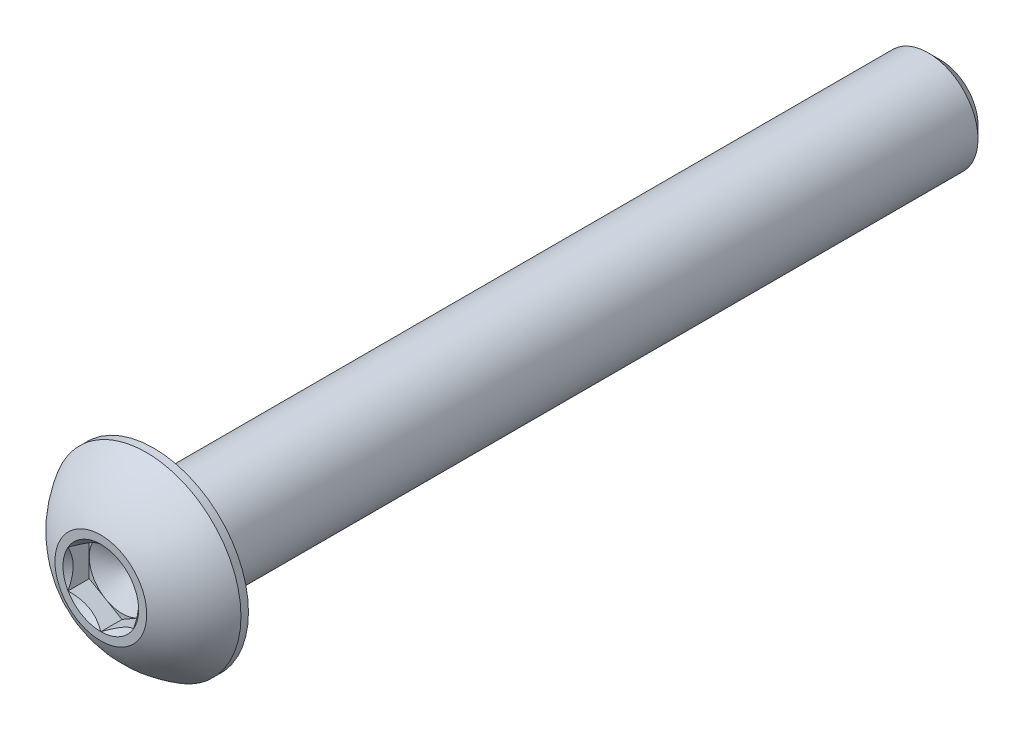
ISO-10303-21;
HEADER;
FILE_DESCRIPTION(('STEP AP214'),'2;1');
FILE_NAME('part.step','',(''),(''),'','','');
FILE_SCHEMA(('AUTOMOTIVE_DESIGN { 1 0 10303 214 1 1 1 1 }'));
ENDSEC;
DATA;
#1=APPLICATION_CONTEXT('core data for automotive mechanical design processes');
#2=APPLICATION_PROTOCOL_DEFINITION('international standard','automotive_design',2000,#1);
#3=PRODUCT_CONTEXT('',#1,'mechanical');
#4=PRODUCT('Part','Part','',(#3));
#5=PRODUCT_RELATED_PRODUCT_CATEGORY('part','',(#4));
#6=PRODUCT_DEFINITION_FORMATION('','',#4);
#7=PRODUCT_DEFINITION_CONTEXT('part definition',#1,'design');
#8=PRODUCT_DEFINITION('design','',#6,#7);
#9=PRODUCT_DEFINITION_SHAPE('','',#8);
#10=(LENGTH_UNIT() NAMED_UNIT(*) SI_UNIT(.MILLI.,.METRE.));
#11=(NAMED_UNIT(*) PLANE_ANGLE_UNIT() SI_UNIT($,.RADIAN.));
#12=(NAMED_UNIT(*) SI_UNIT($,.STERADIAN.) SOLID_ANGLE_UNIT());
#13=UNCERTAINTY_MEASURE_WITH_UNIT(LENGTH_MEASURE(1.E-05),#10,'distance_accuracy_value','');
#14=(GEOMETRIC_REPRESENTATION_CONTEXT(3) GLOBAL_UNCERTAINTY_ASSIGNED_CONTEXT((#13)) GLOBAL_UNIT_ASSIGNED_CONTEXT((#10,
#11,#12)) REPRESENTATION_CONTEXT('',''));
#15=CARTESIAN_POINT('',(0.,0.,0.));
#16=DIRECTION('',(0.,0.,1.));
#17=DIRECTION('',(1.,0.,0.));
#18=AXIS2_PLACEMENT_3D('',#15,#16,#17);
#19=CARTESIAN_POINT('',(0.,0.,19.3065399998886));
#20=DIRECTION('',(0.,0.,1.));
#21=DIRECTION('',(1.,0.,0.));
#22=AXIS2_PLACEMENT_3D('',#19,#20,#21);
#23=CONICAL_SURFACE('',#22,1.5874999998573,1.04719755098333);
#24=CARTESIAN_POINT('',(3.12638803734444E-10,0.,18.3899964475245));
#25=VERTEX_POINT('',#24);
#26=VERTEX_LOOP('',#25);
#27=FACE_BOUND('',#26,.T.);
#28=CARTESIAN_POINT('',(0.,0.,19.3065399999871));
#29=DIRECTION('',(0.,0.,1.));
#30=DIRECTION('',(1.,0.,0.));
#31=AXIS2_PLACEMENT_3D('',#28,#29,#30);
#32=CIRCLE('',#31,1.58750000002783);
#33=CARTESIAN_POINT('',(1.58750000001392,0.,19.3065399999935));
#34=VERTEX_POINT('',#33);
#35=CARTESIAN_POINT('',(0.793750000006958,-1.37481532851985,19.3065399999935));
#36=VERTEX_POINT('',#35);
#37=EDGE_CURVE('E20',#34,#36,#32,.F.);
#38=ORIENTED_EDGE('',*,*,#37,.F.);
#39=CARTESIAN_POINT('',(0.,0.,19.3065399999871));
#40=DIRECTION('',(0.,0.,1.));
#41=DIRECTION('',(1.,0.,0.));
#42=AXIS2_PLACEMENT_3D('',#39,#40,#41);
#43=CIRCLE('',#42,1.58750000002783);
#44=CARTESIAN_POINT('',(0.793750000006957,1.37481532851985,19.3065399999935));
#45=VERTEX_POINT('',#44);
#46=EDGE_CURVE('E408',#45,#34,#43,.F.);
#47=ORIENTED_EDGE('',*,*,#46,.F.);
#48=CARTESIAN_POINT('',(0.,0.,19.3065399999871));
#49=DIRECTION('',(0.,0.,1.));
#50=DIRECTION('',(1.,0.,0.));
#51=AXIS2_PLACEMENT_3D('',#48,#49,#50);
#52=CIRCLE('',#51,1.58750000002783);
#53=CARTESIAN_POINT('',(-0.793750000006959,1.37481532851985,19.3065399999935));
#54=VERTEX_POINT('',#53);
#55=EDGE_CURVE('E113',#54,#45,#52,.F.);
#56=ORIENTED_EDGE('',*,*,#55,.F.);
#57=CARTESIAN_POINT('',(0.,0.,19.3065399999871));
#58=DIRECTION('',(0.,0.,1.));
#59=DIRECTION('',(1.,0.,0.));
#60=AXIS2_PLACEMENT_3D('',#57,#58,#59);
#61=CIRCLE('',#60,1.58750000002783);
#62=CARTESIAN_POINT('',(-1.58750000001392,0.,19.3065399999935));
#63=VERTEX_POINT('',#62);
#64=EDGE_CURVE('E412',#63,#54,#61,.F.);
#65=ORIENTED_EDGE('',*,*,#64,.F.);
#66=CARTESIAN_POINT('',(0.,0.,19.3065399999871));
#67=DIRECTION('',(0.,0.,1.));
#68=DIRECTION('',(1.,0.,0.));
#69=AXIS2_PLACEMENT_3D('',#66,#67,#68);
#70=CIRCLE('',#69,1.58750000002783);
#71=CARTESIAN_POINT('',(-0.793750000006957,-1.37481532851985,19.3065399999935));
#72=VERTEX_POINT('',#71);
#73=EDGE_CURVE('E407',#72,#63,#70,.F.);
#74=ORIENTED_EDGE('',*,*,#73,.F.);
#75=CARTESIAN_POINT('',(0.,0.,19.3065399999871));
#76=DIRECTION('',(0.,0.,1.));
#77=DIRECTION('',(1.,0.,0.));
#78=AXIS2_PLACEMENT_3D('',#75,#76,#77);
#79=CIRCLE('',#78,1.58750000002783);
#80=EDGE_CURVE('E404',#36,#72,#79,.F.);
#81=ORIENTED_EDGE('',*,*,#80,.F.);
#82=EDGE_LOOP('',(#38,#47,#56,#65,#74,#81));
#83=FACE_BOUND('',#82,.T.);
#84=ADVANCED_FACE('F17',(#27,#83),#23,.F.);
#85=CARTESIAN_POINT('',(0.,0.,19.30654));
#86=DIRECTION('',(0.,0.,1.));
#87=DIRECTION('',(1.,0.,0.));
#88=AXIS2_PLACEMENT_3D('',#85,#86,#87);
#89=PLANE('',#88);
#90=DIRECTION('',(0.,1.,0.));
#91=VECTOR('',#90,1.);
#92=CARTESIAN_POINT('',(-1.5875,0.91654355233853,19.30654));
#93=LINE('',#92,#91);
#94=CARTESIAN_POINT('',(-1.5875,-0.916543552338531,19.30654));
#95=VERTEX_POINT('',#94);
#96=EDGE_CURVE('E139',#95,#63,#93,.T.);
#97=ORIENTED_EDGE('',*,*,#96,.F.);
#98=DIRECTION('',(-0.866025403784439,0.5,0.));
#99=VECTOR('',#98,1.);
#100=CARTESIAN_POINT('',(-1.5875,-0.916543552338531,19.30654));
#101=LINE('',#100,#99);
#102=EDGE_CURVE('E163',#72,#95,#101,.T.);
#103=ORIENTED_EDGE('',*,*,#102,.F.);
#104=ORIENTED_EDGE('',*,*,#73,.T.);
#105=EDGE_LOOP('',(#97,#103,#104));
#106=FACE_BOUND('',#105,.T.);
#107=ADVANCED_FACE('F352',(#106),#89,.T.);
#108=CARTESIAN_POINT('',(0.,0.,19.30654));
#109=DIRECTION('',(0.,0.,1.));
#110=DIRECTION('',(1.,0.,0.));
#111=AXIS2_PLACEMENT_3D('',#108,#109,#110);
#112=PLANE('',#111);
#113=DIRECTION('',(-0.866025403784439,0.5,0.));
#114=VECTOR('',#113,1.);
#115=CARTESIAN_POINT('',(-1.5875,-0.916543552338531,19.30654));
#116=LINE('',#115,#114);
#117=CARTESIAN_POINT('',(0.,-1.83308710467706,19.30654));
#118=VERTEX_POINT('',#117);
#119=EDGE_CURVE('E85',#118,#72,#116,.T.);
#120=ORIENTED_EDGE('',*,*,#119,.F.);
#121=DIRECTION('',(-0.866025403784438,-0.5,0.));
#122=VECTOR('',#121,1.);
#123=CARTESIAN_POINT('',(0.,-1.83308710467706,19.30654));
#124=LINE('',#123,#122);
#125=EDGE_CURVE('E154',#36,#118,#124,.T.);
#126=ORIENTED_EDGE('',*,*,#125,.F.);
#127=ORIENTED_EDGE('',*,*,#80,.T.);
#128=EDGE_LOOP('',(#120,#126,#127));
#129=FACE_BOUND('',#128,.T.);
#130=ADVANCED_FACE('F349',(#129),#112,.T.);
#131=CARTESIAN_POINT('',(0.,0.,19.30654));
#132=DIRECTION('',(0.,0.,1.));
#133=DIRECTION('',(1.,0.,0.));
#134=AXIS2_PLACEMENT_3D('',#131,#132,#133);
#135=PLANE('',#134);
#136=DIRECTION('',(-0.866025403784438,-0.5,0.));
#137=VECTOR('',#136,1.);
#138=CARTESIAN_POINT('',(0.,-1.83308710467706,19.30654));
#139=LINE('',#138,#137);
#140=CARTESIAN_POINT('',(1.5875,-0.91654355233853,19.30654));
#141=VERTEX_POINT('',#140);
#142=EDGE_CURVE('E151',#141,#36,#139,.T.);
#143=ORIENTED_EDGE('',*,*,#142,.F.);
#144=DIRECTION('',(0.,-1.,0.));
#145=VECTOR('',#144,1.);
#146=CARTESIAN_POINT('',(1.5875,-0.916543552338531,19.30654));
#147=LINE('',#146,#145);
#148=EDGE_CURVE('E143',#34,#141,#147,.T.);
#149=ORIENTED_EDGE('',*,*,#148,.F.);
#150=ORIENTED_EDGE('',*,*,#37,.T.);
#151=EDGE_LOOP('',(#143,#149,#150));
#152=FACE_BOUND('',#151,.T.);
#153=ADVANCED_FACE('F346',(#152),#135,.T.);
#154=CARTESIAN_POINT('',(0.,0.,19.30654));
#155=DIRECTION('',(0.,0.,1.));
#156=DIRECTION('',(1.,0.,0.));
#157=AXIS2_PLACEMENT_3D('',#154,#155,#156);
#158=PLANE('',#157);
#159=DIRECTION('',(0.,-1.,0.));
#160=VECTOR('',#159,1.);
#161=CARTESIAN_POINT('',(1.5875,-0.916543552338531,19.30654));
#162=LINE('',#161,#160);
#163=CARTESIAN_POINT('',(1.5875,0.916543552338532,19.30654));
#164=VERTEX_POINT('',#163);
#165=EDGE_CURVE('E100',#164,#34,#162,.T.);
#166=ORIENTED_EDGE('',*,*,#165,.F.);
#167=DIRECTION('',(0.866025403784439,-0.499999999999999,0.));
#168=VECTOR('',#167,1.);
#169=CARTESIAN_POINT('',(1.5875,0.916543552338532,19.30654));
#170=LINE('',#169,#168);
#171=EDGE_CURVE('E115',#45,#164,#170,.T.);
#172=ORIENTED_EDGE('',*,*,#171,.F.);
#173=ORIENTED_EDGE('',*,*,#46,.T.);
#174=EDGE_LOOP('',(#166,#172,#173));
#175=FACE_BOUND('',#174,.T.);
#176=ADVANCED_FACE('F342',(#175),#158,.T.);
#177=CARTESIAN_POINT('',(0.,0.,19.30654));
#178=DIRECTION('',(0.,0.,1.));
#179=DIRECTION('',(1.,0.,0.));
#180=AXIS2_PLACEMENT_3D('',#177,#178,#179);
#181=PLANE('',#180);
#182=DIRECTION('',(0.866025403784438,0.500000000000001,0.));
#183=VECTOR('',#182,1.);
#184=CARTESIAN_POINT('',(0.,1.83308710467706,19.30654));
#185=LINE('',#184,#183);
#186=CARTESIAN_POINT('',(-1.5875,0.91654355233853,19.30654));
#187=VERTEX_POINT('',#186);
#188=EDGE_CURVE('E127',#187,#54,#185,.T.);
#189=ORIENTED_EDGE('',*,*,#188,.F.);
#190=DIRECTION('',(0.,1.,0.));
#191=VECTOR('',#190,1.);
#192=CARTESIAN_POINT('',(-1.5875,0.91654355233853,19.30654));
#193=LINE('',#192,#191);
#194=EDGE_CURVE('E94',#63,#187,#193,.T.);
#195=ORIENTED_EDGE('',*,*,#194,.F.);
#196=ORIENTED_EDGE('',*,*,#64,.T.);
#197=EDGE_LOOP('',(#189,#195,#196));
#198=FACE_BOUND('',#197,.T.);
#199=ADVANCED_FACE('F339',(#198),#181,.T.);
#200=CARTESIAN_POINT('',(0.,0.,19.30654));
#201=DIRECTION('',(0.,0.,1.));
#202=DIRECTION('',(1.,0.,0.));
#203=AXIS2_PLACEMENT_3D('',#200,#201,#202);
#204=PLANE('',#203);
#205=DIRECTION('',(0.866025403784439,-0.499999999999999,0.));
#206=VECTOR('',#205,1.);
#207=CARTESIAN_POINT('',(1.5875,0.916543552338532,19.30654));
#208=LINE('',#207,#206);
#209=CARTESIAN_POINT('',(0.,1.83308710467706,19.30654));
#210=VERTEX_POINT('',#209);
#211=EDGE_CURVE('E108',#210,#45,#208,.T.);
#212=ORIENTED_EDGE('',*,*,#211,.F.);
#213=DIRECTION('',(0.866025403784438,0.500000000000001,0.));
#214=VECTOR('',#213,1.);
#215=CARTESIAN_POINT('',(0.,1.83308710467706,19.30654));
#216=LINE('',#215,#214);
#217=EDGE_CURVE('E111',#54,#210,#216,.T.);
#218=ORIENTED_EDGE('',*,*,#217,.F.);
#219=ORIENTED_EDGE('',*,*,#55,.T.);
#220=EDGE_LOOP('',(#212,#218,#219));
#221=FACE_BOUND('',#220,.T.);
#222=ADVANCED_FACE('F109',(#221),#204,.T.);
#223=CARTESIAN_POINT('',(-1.5875,0.91654355233853,20.3327));
#224=DIRECTION('',(1.,0.,0.));
#225=DIRECTION('',(0.,0.,-1.));
#226=AXIS2_PLACEMENT_3D('',#223,#224,#225);
#227=PLANE('',#226);
#228=ORIENTED_EDGE('',*,*,#194,.T.);
#229=DIRECTION('',(0.,0.,1.));
#230=VECTOR('',#229,1.);
#231=CARTESIAN_POINT('',(-1.5875,0.91654355233853,20.3327));
#232=LINE('',#231,#230);
#233=CARTESIAN_POINT('',(-1.58749999999757,0.916543552337384,20.332699999986));
#234=VERTEX_POINT('',#233);
#235=EDGE_CURVE('E129',#234,#187,#232,.F.);
#236=ORIENTED_EDGE('',*,*,#235,.F.);
#237=CARTESIAN_POINT('',(-1.5875,0.916543552339043,20.332699999989));
#238=CARTESIAN_POINT('',(-1.5875,0.853539453355364,20.3012281823458));
#239=CARTESIAN_POINT('',(-1.5875,0.789481924479288,20.2716050627668));
#240=CARTESIAN_POINT('',(-1.5875,0.658862049373346,20.2173663954386));
#241=CARTESIAN_POINT('',(-1.5875,0.592287287974166,20.1927810162048));
#242=CARTESIAN_POINT('',(-1.5875,0.458042547295722,20.1506660960921));
#243=CARTESIAN_POINT('',(-1.5875,0.390406737675044,20.1330307295211));
#244=CARTESIAN_POINT('',(-1.5875,0.253646529232072,20.1058600886482));
#245=CARTESIAN_POINT('',(-1.5875,0.184526305235239,20.0963045400924));
#246=CARTESIAN_POINT('',(-1.5875,0.065394416520805,20.0876827418486));
#247=CARTESIAN_POINT('',(-1.5875,0.0155365509524436,20.0864068217334));
#248=CARTESIAN_POINT('',(-1.5875,-0.0840976089196722,20.088559137801));
#249=CARTESIAN_POINT('',(-1.5875,-0.133873868510491,20.0919890228324));
#250=CARTESIAN_POINT('',(-1.5875,-0.232943743912944,20.1033563141319));
#251=CARTESIAN_POINT('',(-1.5875,-0.282236904574519,20.1112976201583));
#252=CARTESIAN_POINT('',(-1.5875,-0.379995839884181,20.1312562767678));
#253=CARTESIAN_POINT('',(-1.5875,-0.428461250145922,20.1432753762239));
#254=CARTESIAN_POINT('',(-1.5875,-0.552553397791442,20.1789438318172));
#255=CARTESIAN_POINT('',(-1.5875,-0.627411798332486,20.2052777074803));
#256=CARTESIAN_POINT('',(-1.5875,-0.737482851501277,20.2497306145143));
#257=CARTESIAN_POINT('',(-1.5875,-0.773754680832458,20.26534835924));
#258=CARTESIAN_POINT('',(-1.5875,-0.845631639913836,20.2980094505363));
#259=CARTESIAN_POINT('',(-1.5875,-0.881237077141329,20.3150521187486));
#260=CARTESIAN_POINT('',(-1.5875,-0.916543552339045,20.332699999989));
#261=B_SPLINE_CURVE_WITH_KNOTS('',3,(#237,#238,#239,#240,#241,#242,#243,#244,#245,#246,#247,
#248,#249,#250,#251,#252,#253,#254,#255,#256,#257,#258,#259,#260),.UNSPECIFIED.,.F.,.F.,(4,2,2,
2,2,2,2,2,2,2,2,4),(0.,0.211427927696953,0.424087197077954,0.633370156318796,0.842126401378753,
0.991537200917105,1.14100036529431,1.29059292550163,1.44024972383366,1.6778172140134,
1.79627069403443,1.91466809995665),.UNSPECIFIED.);
#262=CARTESIAN_POINT('',(-1.58749999999536,-0.91654355234121,20.332699999986));
#263=VERTEX_POINT('',#262);
#264=EDGE_CURVE('E123',#234,#263,#261,.T.);
#265=ORIENTED_EDGE('',*,*,#264,.T.);
#266=DIRECTION('',(0.,0.,1.));
#267=VECTOR('',#266,1.);
#268=CARTESIAN_POINT('',(-1.5875,-0.916543552338531,20.3327));
#269=LINE('',#268,#267);
#270=EDGE_CURVE('E155',#95,#263,#269,.T.);
#271=ORIENTED_EDGE('',*,*,#270,.F.);
#272=ORIENTED_EDGE('',*,*,#96,.T.);
#273=EDGE_LOOP('',(#228,#236,#265,#271,#272));
#274=FACE_BOUND('',#273,.T.);
#275=ADVANCED_FACE('F333',(#274),#227,.T.);
#276=CARTESIAN_POINT('',(-1.5875,-0.916543552338531,20.3327));
#277=DIRECTION('',(0.5,0.866025403784439,0.));
#278=DIRECTION('',(-0.866025403784439,0.5,0.));
#279=AXIS2_PLACEMENT_3D('',#276,#277,#278);
#280=PLANE('',#279);
#281=ORIENTED_EDGE('',*,*,#102,.T.);
#282=ORIENTED_EDGE('',*,*,#270,.T.);
#283=CARTESIAN_POINT('',(-1.58750000000044,-0.916543552338275,20.332699999989));
#284=CARTESIAN_POINT('',(-1.53293684973803,-0.948045601830115,20.3012281823458));
#285=CARTESIAN_POINT('',(-1.47746140242769,-0.980074366268153,20.2716050627668));
#286=CARTESIAN_POINT('',(-1.36434127234679,-1.04538430382112,20.2173663954386));
#287=CARTESIAN_POINT('',(-1.30668583772422,-1.07867168452071,20.1927810162048));
#288=CARTESIAN_POINT('',(-1.19042648197223,-1.14579405485994,20.1506660960921));
#289=CARTESIAN_POINT('',(-1.13185215263519,-1.17961195967028,20.1330307295211));
#290=CARTESIAN_POINT('',(-1.01341433789673,-1.24799206389176,20.1058600886482));
#291=CARTESIAN_POINT('',(-0.953554468000198,-1.28255217589018,20.0963045400924));
#292=CARTESIAN_POINT('',(-0.850383225972677,-1.34211812024739,20.0876827418486));
#293=CARTESIAN_POINT('',(-0.807205047812007,-1.36704705303158,20.0864068217334));
#294=CARTESIAN_POINT('',(-0.720919334278034,-1.41686413296763,20.088559137801));
#295=CARTESIAN_POINT('',(-0.677811828967016,-1.44175226276304,20.0919890228324));
#296=CARTESIAN_POINT('',(-0.592014800118733,-1.49128720046427,20.1033563141319));
#297=CARTESIAN_POINT('',(-0.549325670752981,-1.51593378079506,20.1112976201583));
#298=CARTESIAN_POINT('',(-0.464663949327894,-1.56481324844989,20.1312562767678));
#299=CARTESIAN_POINT('',(-0.422691672836392,-1.58904595358076,20.1432753762239));
#300=CARTESIAN_POINT('',(-0.315224720565202,-1.65109202740352,20.1789438318172));
#301=CARTESIAN_POINT('',(-0.250395444009987,-1.68852122767404,20.2052777074803));
#302=CARTESIAN_POINT('',(-0.155071115744506,-1.74355675425844,20.2497306145143));
#303=CARTESIAN_POINT('',(-0.12365879010197,-1.76169266892403,20.26534835924));
#304=CARTESIAN_POINT('',(-0.0614115175907221,-1.79763114846471,20.2980094505363));
#305=CARTESIAN_POINT('',(-0.0305763044388607,-1.81543386707846,20.3150521187486));
#306=CARTESIAN_POINT('',(4.45932977983326E-13,-1.83308710467732,20.332699999989));
#307=B_SPLINE_CURVE_WITH_KNOTS('',3,(#283,#284,#285,#286,#287,#288,#289,#290,#291,#292,#293,
#294,#295,#296,#297,#298,#299,#300,#301,#302,#303,#304,#305,#306),.UNSPECIFIED.,.F.,.F.,(4,2,2,
2,2,2,2,2,2,2,2,4),(0.,0.211427927696953,0.424087197077954,0.633370156318797,0.842126401378753,
0.991537200917105,1.14100036529431,1.29059292550163,1.44024972383366,1.6778172140134,
1.79627069403443,1.91466809995665),.UNSPECIFIED.);
#308=CARTESIAN_POINT('',(4.64003932446759E-12,-1.83308710467438,20.332699999986));
#309=VERTEX_POINT('',#308);
#310=EDGE_CURVE('E234',#263,#309,#307,.T.);
#311=ORIENTED_EDGE('',*,*,#310,.T.);
#312=DIRECTION('',(0.,0.,1.));
#313=VECTOR('',#312,1.);
#314=CARTESIAN_POINT('',(0.,-1.83308710467706,20.3327));
#315=LINE('',#314,#313);
#316=EDGE_CURVE('E144',#118,#309,#315,.T.);
#317=ORIENTED_EDGE('',*,*,#316,.F.);
#318=ORIENTED_EDGE('',*,*,#119,.T.);
#319=EDGE_LOOP('',(#281,#282,#311,#317,#318));
#320=FACE_BOUND('',#319,.T.);
#321=ADVANCED_FACE('F232',(#320),#280,.T.);
#322=CARTESIAN_POINT('',(0.,-1.83308710467706,20.3327));
#323=DIRECTION('',(-0.5,0.866025403784438,0.));
#324=DIRECTION('',(-0.866025403784438,-0.5,0.));
#325=AXIS2_PLACEMENT_3D('',#322,#323,#324);
#326=PLANE('',#325);
#327=ORIENTED_EDGE('',*,*,#125,.T.);
#328=ORIENTED_EDGE('',*,*,#316,.T.);
#329=CARTESIAN_POINT('',(-4.42504332827862E-13,-1.83308710467732,20.332699999989));
#330=CARTESIAN_POINT('',(0.0545631502619731,-1.80158505518548,20.3012281823458));
#331=CARTESIAN_POINT('',(0.11003859757231,-1.76955629074744,20.2716050627668));
#332=CARTESIAN_POINT('',(0.223158727653206,-1.70424635319447,20.2173663954386));
#333=CARTESIAN_POINT('',(0.280814162275784,-1.67095897249488,20.1927810162048));
#334=CARTESIAN_POINT('',(0.397073518027771,-1.60383660215566,20.1506660960921));
#335=CARTESIAN_POINT('',(0.455647847364806,-1.57001869734532,20.1330307295211));
#336=CARTESIAN_POINT('',(0.574085662103275,-1.50163859312383,20.1058600886482));
#337=CARTESIAN_POINT('',(0.633945531999802,-1.46707848112542,20.0963045400924));
#338=CARTESIAN_POINT('',(0.737116774027323,-1.4075125367682,20.0876827418486));
#339=CARTESIAN_POINT('',(0.780294952187994,-1.38258360398402,20.0864068217334));
#340=CARTESIAN_POINT('',(0.866580665721966,-1.33276652404796,20.088559137801));
#341=CARTESIAN_POINT('',(0.909688171032984,-1.30787839425255,20.0919890228324));
#342=CARTESIAN_POINT('',(0.995485199881267,-1.25834345655132,20.1033563141319));
#343=CARTESIAN_POINT('',(1.03817432924702,-1.23369687622054,20.1112976201583));
#344=CARTESIAN_POINT('',(1.12283605067211,-1.18481740856571,20.1312562767678));
#345=CARTESIAN_POINT('',(1.16480832716361,-1.16058470343484,20.1432753762239));
#346=CARTESIAN_POINT('',(1.2722752794348,-1.09853862961207,20.1789438318172));
#347=CARTESIAN_POINT('',(1.33710455599001,-1.06110942934155,20.2052777074803));
#348=CARTESIAN_POINT('',(1.43242888425549,-1.00607390275716,20.2497306145143));
#349=CARTESIAN_POINT('',(1.46384120989803,-0.987937988091567,20.26534835924));
#350=CARTESIAN_POINT('',(1.52608848240928,-0.951999508550878,20.2980094505363));
#351=CARTESIAN_POINT('',(1.55692369556114,-0.934196789937131,20.3150521187486));
#352=CARTESIAN_POINT('',(1.58750000000044,-0.916543552338274,20.332699999989));
#353=B_SPLINE_CURVE_WITH_KNOTS('',3,(#329,#330,#331,#332,#333,#334,#335,#336,#337,#338,#339,
#340,#341,#342,#343,#344,#345,#346,#347,#348,#349,#350,#351,#352),.UNSPECIFIED.,.F.,.F.,(4,2,2,
2,2,2,2,2,2,2,2,4),(0.,0.211427927696953,0.424087197077954,0.633370156318797,0.842126401378753,
0.991537200917105,1.14100036529431,1.29059292550163,1.44024972383366,1.6778172140134,
1.79627069403443,1.91466809995665),.UNSPECIFIED.);
#354=CARTESIAN_POINT('',(1.5875,-0.916543552333174,20.332699999986));
#355=VERTEX_POINT('',#354);
#356=EDGE_CURVE('E252',#309,#355,#353,.T.);
#357=ORIENTED_EDGE('',*,*,#356,.T.);
#358=DIRECTION('',(0.,0.,1.));
#359=VECTOR('',#358,1.);
#360=CARTESIAN_POINT('',(1.5875,-0.916543552338531,20.3327));
#361=LINE('',#360,#359);
#362=EDGE_CURVE('E116',#141,#355,#361,.T.);
#363=ORIENTED_EDGE('',*,*,#362,.F.);
#364=ORIENTED_EDGE('',*,*,#142,.T.);
#365=EDGE_LOOP('',(#327,#328,#357,#363,#364));
#366=FACE_BOUND('',#365,.T.);
#367=ADVANCED_FACE('F292',(#366),#326,.T.);
#368=CARTESIAN_POINT('',(1.5875,-0.916543552338531,20.3327));
#369=DIRECTION('',(-1.,0.,0.));
#370=DIRECTION('',(0.,-1.,0.));
#371=AXIS2_PLACEMENT_3D('',#368,#369,#370);
#372=PLANE('',#371);
#373=ORIENTED_EDGE('',*,*,#148,.T.);
#374=ORIENTED_EDGE('',*,*,#362,.T.);
#375=CARTESIAN_POINT('',(1.5875,-0.916543552339043,20.332699999989));
#376=CARTESIAN_POINT('',(1.5875,-0.853951042738525,20.3014329469253));
#377=CARTESIAN_POINT('',(1.5875,-0.790318655172071,20.2719915815028));
#378=CARTESIAN_POINT('',(1.5875,-0.660541633648582,20.2180249640266));
#379=CARTESIAN_POINT('',(1.5875,-0.5943835060602,20.1935324485101));
#380=CARTESIAN_POINT('',(1.5875,-0.460155167703544,20.151239138281));
#381=CARTESIAN_POINT('',(1.5875,-0.392092287363228,20.1334156966594));
#382=CARTESIAN_POINT('',(1.5875,-0.254474472994449,20.1059757377809));
#383=CARTESIAN_POINT('',(1.5875,-0.184924844081931,20.0963338418326));
#384=CARTESIAN_POINT('',(1.5875,-0.0959348173009542,20.0898928821038));
#385=CARTESIAN_POINT('',(1.5875,-0.0767574755174642,20.0888515804515));
#386=CARTESIAN_POINT('',(1.5875,-0.0383876515898456,20.0874614610272));
#387=CARTESIAN_POINT('',(1.5875,-0.0191951833455963,20.0871122670778));
#388=CARTESIAN_POINT('',(1.5875,0.0481761373886723,20.0871144720552));
#389=CARTESIAN_POINT('',(1.5875,0.0963693775085094,20.0893196183869));
#390=CARTESIAN_POINT('',(1.5875,0.19237997675969,20.0980092409859));
#391=CARTESIAN_POINT('',(1.5875,0.240197050167187,20.1044967019832));
#392=CARTESIAN_POINT('',(1.5875,0.383011002180387,20.1299769835574));
#393=CARTESIAN_POINT('',(1.5875,0.476967063071659,20.1549833808722));
#394=CARTESIAN_POINT('',(1.5875,0.628737189873111,20.2061400287179));
#395=CARTESIAN_POINT('',(1.5875,0.687787687826916,20.2288876621357));
#396=CARTESIAN_POINT('',(1.5875,0.803652764112649,20.2781891232105));
#397=CARTESIAN_POINT('',(1.5875,0.860482853226923,20.3047062344164));
#398=CARTESIAN_POINT('',(1.5875,0.916543552339045,20.332699999989));
#399=B_SPLINE_CURVE_WITH_KNOTS('',3,(#375,#376,#377,#378,#379,#380,#381,#382,#383,#384,#385,
#386,#387,#388,#389,#390,#391,#392,#393,#394,#395,#396,#397,#398),.UNSPECIFIED.,.F.,.F.,(4,2,2,
2,2,2,2,2,2,2,2,4),(0.,0.210047204135898,0.421441388610297,0.632111059435549,0.84212483077691,
0.899732953394875,0.957309755985773,1.10181621378191,1.246423497621,1.53683268062116,
1.72655304068149,1.91453812061573),.UNSPECIFIED.);
#400=CARTESIAN_POINT('',(1.58749999999536,0.91654355234121,20.332699999986));
#401=VERTEX_POINT('',#400);
#402=EDGE_CURVE('E296',#355,#401,#399,.T.);
#403=ORIENTED_EDGE('',*,*,#402,.T.);
#404=DIRECTION('',(0.,0.,1.));
#405=VECTOR('',#404,1.);
#406=CARTESIAN_POINT('',(1.5875,0.916543552338532,20.3327));
#407=LINE('',#406,#405);
#408=EDGE_CURVE('E148',#164,#401,#407,.T.);
#409=ORIENTED_EDGE('',*,*,#408,.F.);
#410=ORIENTED_EDGE('',*,*,#165,.T.);
#411=EDGE_LOOP('',(#373,#374,#403,#409,#410));
#412=FACE_BOUND('',#411,.T.);
#413=ADVANCED_FACE('F288',(#412),#372,.T.);
#414=CARTESIAN_POINT('',(1.5875,0.916543552338532,20.3327));
#415=DIRECTION('',(-0.499999999999999,-0.866025403784439,0.));
#416=DIRECTION('',(0.866025403784439,-0.499999999999999,0.));
#417=AXIS2_PLACEMENT_3D('',#414,#415,#416);
#418=PLANE('',#417);
#419=ORIENTED_EDGE('',*,*,#171,.T.);
#420=ORIENTED_EDGE('',*,*,#408,.T.);
#421=CARTESIAN_POINT('',(1.58750000000044,0.916543552338275,20.332699999989));
#422=CARTESIAN_POINT('',(1.53293684973803,0.948045601830115,20.3012281823458));
#423=CARTESIAN_POINT('',(1.47746140242769,0.980074366268153,20.2716050627668));
#424=CARTESIAN_POINT('',(1.3643412723468,1.04538430382112,20.2173663954386));
#425=CARTESIAN_POINT('',(1.30668583772422,1.07867168452071,20.1927810162048));
#426=CARTESIAN_POINT('',(1.19042648197223,1.14579405485994,20.1506660960921));
#427=CARTESIAN_POINT('',(1.1318521526352,1.17961195967027,20.1330307295211));
#428=CARTESIAN_POINT('',(1.01341433789673,1.24799206389176,20.1058600886482));
#429=CARTESIAN_POINT('',(0.953554468000199,1.28255217589018,20.0963045400924));
#430=CARTESIAN_POINT('',(0.850383225972677,1.34211812024739,20.0876827418486));
#431=CARTESIAN_POINT('',(0.807205047812007,1.36704705303158,20.0864068217334));
#432=CARTESIAN_POINT('',(0.720919334278034,1.41686413296763,20.088559137801));
#433=CARTESIAN_POINT('',(0.677811828967017,1.44175226276304,20.0919890228324));
#434=CARTESIAN_POINT('',(0.592014800118733,1.49128720046427,20.1033563141319));
#435=CARTESIAN_POINT('',(0.549325670752981,1.51593378079506,20.1112976201583));
#436=CARTESIAN_POINT('',(0.464663949327894,1.56481324844989,20.1312562767678));
#437=CARTESIAN_POINT('',(0.422691672836392,1.58904595358076,20.1432753762239));
#438=CARTESIAN_POINT('',(0.315224720565202,1.65109202740352,20.1789438318172));
#439=CARTESIAN_POINT('',(0.250395444009987,1.68852122767404,20.2052777074803));
#440=CARTESIAN_POINT('',(0.155071115744506,1.74355675425844,20.2497306145143));
#441=CARTESIAN_POINT('',(0.12365879010197,1.76169266892403,20.26534835924));
#442=CARTESIAN_POINT('',(0.0614115175907221,1.79763114846471,20.2980094505363));
#443=CARTESIAN_POINT('',(0.0305763044388607,1.81543386707846,20.3150521187486));
#444=CARTESIAN_POINT('',(-4.45942778390295E-13,1.83308710467732,20.332699999989));
#445=B_SPLINE_CURVE_WITH_KNOTS('',3,(#421,#422,#423,#424,#425,#426,#427,#428,#429,#430,#431,
#432,#433,#434,#435,#436,#437,#438,#439,#440,#441,#442,#443,#444),.UNSPECIFIED.,.F.,.F.,(4,2,2,
2,2,2,2,2,2,2,2,4),(0.,0.211427927696953,0.424087197077954,0.633370156318795,0.842126401378753,
0.991537200917105,1.14100036529431,1.29059292550163,1.44024972383366,1.6778172140134,
1.79627069403443,1.91466809995665),.UNSPECIFIED.);
#446=CARTESIAN_POINT('',(-4.63955620518583E-12,1.83308710467438,20.332699999986));
#447=VERTEX_POINT('',#446);
#448=EDGE_CURVE('E35',#401,#447,#445,.T.);
#449=ORIENTED_EDGE('',*,*,#448,.T.);
#450=DIRECTION('',(0.,0.,1.));
#451=VECTOR('',#450,1.);
#452=CARTESIAN_POINT('',(0.,1.83308710467706,20.3327));
#453=LINE('',#452,#451);
#454=EDGE_CURVE('E118',#210,#447,#453,.T.);
#455=ORIENTED_EDGE('',*,*,#454,.F.);
#456=ORIENTED_EDGE('',*,*,#211,.T.);
#457=EDGE_LOOP('',(#419,#420,#449,#455,#456));
#458=FACE_BOUND('',#457,.T.);
#459=ADVANCED_FACE('F119',(#458),#418,.T.);
#460=CARTESIAN_POINT('',(0.,1.83308710467706,20.3327));
#461=DIRECTION('',(0.500000000000001,-0.866025403784438,0.));
#462=DIRECTION('',(0.866025403784438,0.500000000000001,0.));
#463=AXIS2_PLACEMENT_3D('',#460,#461,#462);
#464=PLANE('',#463);
#465=ORIENTED_EDGE('',*,*,#217,.T.);
#466=ORIENTED_EDGE('',*,*,#454,.T.);
#467=CARTESIAN_POINT('',(4.430368905224E-13,1.83308710467732,20.332699999989));
#468=CARTESIAN_POINT('',(-0.0545631502619725,1.80158505518548,20.3012281823458));
#469=CARTESIAN_POINT('',(-0.11003859757231,1.76955629074744,20.2716050627668));
#470=CARTESIAN_POINT('',(-0.223158727653206,1.70424635319447,20.2173663954386));
#471=CARTESIAN_POINT('',(-0.280814162275783,1.67095897249488,20.1927810162048));
#472=CARTESIAN_POINT('',(-0.397073518027771,1.60383660215566,20.1506660960921));
#473=CARTESIAN_POINT('',(-0.455647847364806,1.57001869734532,20.1330307295211));
#474=CARTESIAN_POINT('',(-0.574085662103274,1.50163859312383,20.1058600886482));
#475=CARTESIAN_POINT('',(-0.633945531999802,1.46707848112542,20.0963045400924));
#476=CARTESIAN_POINT('',(-0.737116774027323,1.4075125367682,20.0876827418486));
#477=CARTESIAN_POINT('',(-0.780294952187994,1.38258360398402,20.0864068217334));
#478=CARTESIAN_POINT('',(-0.866580665721966,1.33276652404796,20.088559137801));
#479=CARTESIAN_POINT('',(-0.909688171032984,1.30787839425255,20.0919890228324));
#480=CARTESIAN_POINT('',(-0.995485199881267,1.25834345655132,20.1033563141319));
#481=CARTESIAN_POINT('',(-1.03817432924702,1.23369687622054,20.1112976201583));
#482=CARTESIAN_POINT('',(-1.12283605067211,1.1848174085657,20.1312562767678));
#483=CARTESIAN_POINT('',(-1.16480832716361,1.16058470343483,20.1432753762239));
#484=CARTESIAN_POINT('',(-1.2722752794348,1.09853862961207,20.1789438318172));
#485=CARTESIAN_POINT('',(-1.33710455599001,1.06110942934155,20.2052777074803));
#486=CARTESIAN_POINT('',(-1.43242888425549,1.00607390275716,20.2497306145143));
#487=CARTESIAN_POINT('',(-1.46384120989803,0.987937988091567,20.26534835924));
#488=CARTESIAN_POINT('',(-1.52608848240928,0.951999508550878,20.2980094505363));
#489=CARTESIAN_POINT('',(-1.55692369556114,0.934196789937131,20.3150521187486));
#490=CARTESIAN_POINT('',(-1.58750000000044,0.916543552338274,20.332699999989));
#491=B_SPLINE_CURVE_WITH_KNOTS('',3,(#467,#468,#469,#470,#471,#472,#473,#474,#475,#476,#477,
#478,#479,#480,#481,#482,#483,#484,#485,#486,#487,#488,#489,#490),.UNSPECIFIED.,.F.,.F.,(4,2,2,
2,2,2,2,2,2,2,2,4),(0.,0.211427927696953,0.424087197077955,0.633370156318796,0.842126401378754,
0.991537200917106,1.14100036529431,1.29059292550163,1.44024972383366,1.6778172140134,
1.79627069403443,1.91466809995664),.UNSPECIFIED.);
#492=EDGE_CURVE('E246',#447,#234,#491,.T.);
#493=ORIENTED_EDGE('',*,*,#492,.T.);
#494=ORIENTED_EDGE('',*,*,#235,.T.);
#495=ORIENTED_EDGE('',*,*,#188,.T.);
#496=EDGE_LOOP('',(#465,#466,#493,#494,#495));
#497=FACE_BOUND('',#496,.T.);
#498=ADVANCED_FACE('F125',(#497),#464,.T.);
#499=CARTESIAN_POINT('',(0.,0.,20.3326999999831));
#500=DIRECTION('',(0.,0.,1.));
#501=DIRECTION('',(1.,0.,0.));
#502=AXIS2_PLACEMENT_3D('',#499,#500,#501);
#503=CONICAL_SURFACE('',#502,1.83308710467145,0.785398163397448);
#504=ORIENTED_EDGE('',*,*,#264,.F.);
#505=CARTESIAN_POINT('',(0.,0.,20.3326999999831));
#506=DIRECTION('',(0.,0.,1.));
#507=DIRECTION('',(1.,0.,0.));
#508=AXIS2_PLACEMENT_3D('',#505,#506,#507);
#509=CIRCLE('',#508,1.83308710467145);
#510=EDGE_CURVE('E239',#234,#263,#509,.T.);
#511=ORIENTED_EDGE('',*,*,#510,.T.);
#512=EDGE_LOOP('',(#504,#511));
#513=FACE_BOUND('',#512,.T.);
#514=ADVANCED_FACE('F240',(#513),#503,.F.);
#515=CARTESIAN_POINT('',(0.,0.,20.3326999999831));
#516=DIRECTION('',(0.,0.,1.));
#517=DIRECTION('',(1.,0.,0.));
#518=AXIS2_PLACEMENT_3D('',#515,#516,#517);
#519=CONICAL_SURFACE('',#518,1.83308710467145,0.785398163397448);
#520=ORIENTED_EDGE('',*,*,#310,.F.);
#521=CARTESIAN_POINT('',(0.,0.,20.3326999999831));
#522=DIRECTION('',(0.,0.,1.));
#523=DIRECTION('',(1.,0.,0.));
#524=AXIS2_PLACEMENT_3D('',#521,#522,#523);
#525=CIRCLE('',#524,1.83308710467145);
#526=EDGE_CURVE('E245',#263,#309,#525,.T.);
#527=ORIENTED_EDGE('',*,*,#526,.T.);
#528=EDGE_LOOP('',(#520,#527));
#529=FACE_BOUND('',#528,.T.);
#530=ADVANCED_FACE('F250',(#529),#519,.F.);
#531=CARTESIAN_POINT('',(0.,0.,20.3326999999831));
#532=DIRECTION('',(0.,0.,1.));
#533=DIRECTION('',(1.,0.,0.));
#534=AXIS2_PLACEMENT_3D('',#531,#532,#533);
#535=CONICAL_SURFACE('',#534,1.83308710467145,0.785398163397448);
#536=ORIENTED_EDGE('',*,*,#356,.F.);
#537=CARTESIAN_POINT('',(0.,0.,20.3326999999831));
#538=DIRECTION('',(0.,0.,1.));
#539=DIRECTION('',(1.,0.,0.));
#540=AXIS2_PLACEMENT_3D('',#537,#538,#539);
#541=CIRCLE('',#540,1.83308710467145);
#542=EDGE_CURVE('E259',#309,#355,#541,.T.);
#543=ORIENTED_EDGE('',*,*,#542,.T.);
#544=EDGE_LOOP('',(#536,#543));
#545=FACE_BOUND('',#544,.T.);
#546=ADVANCED_FACE('F312',(#545),#535,.F.);
#547=CARTESIAN_POINT('',(0.,0.,20.3326999999831));
#548=DIRECTION('',(0.,0.,1.));
#549=DIRECTION('',(1.,0.,0.));
#550=AXIS2_PLACEMENT_3D('',#547,#548,#549);
#551=CONICAL_SURFACE('',#550,1.83308710467145,0.785398163397448);
#552=ORIENTED_EDGE('',*,*,#402,.F.);
#553=CARTESIAN_POINT('',(0.,0.,20.3326999999831));
#554=DIRECTION('',(0.,0.,1.));
#555=DIRECTION('',(1.,0.,0.));
#556=AXIS2_PLACEMENT_3D('',#553,#554,#555);
#557=CIRCLE('',#556,1.83308710467145);
#558=EDGE_CURVE('E261',#355,#401,#557,.T.);
#559=ORIENTED_EDGE('',*,*,#558,.T.);
#560=EDGE_LOOP('',(#552,#559));
#561=FACE_BOUND('',#560,.T.);
#562=ADVANCED_FACE('F308',(#561),#551,.F.);
#563=CARTESIAN_POINT('',(0.,0.,20.3326999999831));
#564=DIRECTION('',(0.,0.,1.));
#565=DIRECTION('',(1.,0.,0.));
#566=AXIS2_PLACEMENT_3D('',#563,#564,#565);
#567=CONICAL_SURFACE('',#566,1.83308710467145,0.785398163397448);
#568=ORIENTED_EDGE('',*,*,#448,.F.);
#569=CARTESIAN_POINT('',(0.,0.,20.3326999999831));
#570=DIRECTION('',(0.,0.,1.));
#571=DIRECTION('',(1.,0.,0.));
#572=AXIS2_PLACEMENT_3D('',#569,#570,#571);
#573=CIRCLE('',#572,1.83308710467145);
#574=EDGE_CURVE('E398',#401,#447,#573,.T.);
#575=ORIENTED_EDGE('',*,*,#574,.T.);
#576=EDGE_LOOP('',(#568,#575));
#577=FACE_BOUND('',#576,.T.);
#578=ADVANCED_FACE('F311',(#577),#567,.F.);
#579=CARTESIAN_POINT('',(0.,0.,20.3326999999831));
#580=DIRECTION('',(0.,0.,1.));
#581=DIRECTION('',(1.,0.,0.));
#582=AXIS2_PLACEMENT_3D('',#579,#580,#581);
#583=CONICAL_SURFACE('',#582,1.83308710467145,0.785398163397448);
#584=ORIENTED_EDGE('',*,*,#492,.F.);
#585=CARTESIAN_POINT('',(0.,0.,20.3326999999831));
#586=DIRECTION('',(0.,0.,1.));
#587=DIRECTION('',(1.,0.,0.));
#588=AXIS2_PLACEMENT_3D('',#585,#586,#587);
#589=CIRCLE('',#588,1.83308710467145);
#590=EDGE_CURVE('E194',#447,#234,#589,.T.);
#591=ORIENTED_EDGE('',*,*,#590,.T.);
#592=EDGE_LOOP('',(#584,#591));
#593=FACE_BOUND('',#592,.T.);
#594=ADVANCED_FACE('F278',(#593),#583,.F.);
#595=CARTESIAN_POINT('',(0.,1.5875,20.3327));
#596=DIRECTION('',(0.,0.,-1.));
#597=DIRECTION('',(-1.,0.,0.));
#598=AXIS2_PLACEMENT_3D('',#595,#596,#597);
#599=PLANE('',#598);
#600=ORIENTED_EDGE('',*,*,#574,.F.);
#601=ORIENTED_EDGE('',*,*,#558,.F.);
#602=ORIENTED_EDGE('',*,*,#542,.F.);
#603=ORIENTED_EDGE('',*,*,#526,.F.);
#604=ORIENTED_EDGE('',*,*,#510,.F.);
#605=ORIENTED_EDGE('',*,*,#590,.F.);
#606=EDGE_LOOP('',(#600,#601,#602,#603,#604,#605));
#607=FACE_BOUND('',#606,.T.);
#608=CARTESIAN_POINT('',(0.,2.2225,20.3327));
#609=CARTESIAN_POINT('',(0.0624008302364281,2.22249962605221,20.3327));
#610=CARTESIAN_POINT('',(0.124813128311019,2.21986962095672,20.3327));
#611=CARTESIAN_POINT('',(0.249206417298754,2.20936669931514,20.3327));
#612=CARTESIAN_POINT('',(0.311187275416086,2.20149223489734,20.3326999999999));
#613=CARTESIAN_POINT('',(0.434369637431306,2.18053582210496,20.3327000000001));
#614=CARTESIAN_POINT('',(0.495569744276044,2.16744560744352,20.3327000000004));
#615=CARTESIAN_POINT('',(0.616683688787432,2.13614792724308,20.3326999999996));
#616=CARTESIAN_POINT('',(0.676596439991351,2.11793630902187,20.3326999999985));
#617=CARTESIAN_POINT('',(0.853505349098926,2.05587113455763,20.3326999999975));
#618=CARTESIAN_POINT('',(0.967969885248867,2.00453627916372,20.3326999999999));
#619=CARTESIAN_POINT('',(1.18664316010392,1.88335101663532,20.3327000000001));
#620=CARTESIAN_POINT('',(1.29085150873609,1.81349990564611,20.3326999999979));
#621=CARTESIAN_POINT('',(1.43720780844397,1.69642628720797,20.3326999999987));
#622=CARTESIAN_POINT('',(1.48436144118721,1.65532134615803,20.3326999999997));
#623=CARTESIAN_POINT('',(1.5750058299644,1.56931768980706,20.3327000000004));
#624=CARTESIAN_POINT('',(1.61850007372981,1.5244226704864,20.3327000000001));
#625=CARTESIAN_POINT('',(1.70157089948496,1.43110667860198,20.3326999999999));
#626=CARTESIAN_POINT('',(1.74114569788169,1.38268411802348,20.3327));
#627=CARTESIAN_POINT('',(1.8160793728264,1.2826816728376,20.3327));
#628=CARTESIAN_POINT('',(1.85143727079623,1.23110105955583,20.3327));
#629=CARTESIAN_POINT('',(1.95076738927649,1.07218457212973,20.3327));
#630=CARTESIAN_POINT('',(2.00808366205909,0.960575433380767,20.3327));
#631=CARTESIAN_POINT('',(2.10313020676175,0.729378863140993,20.3327));
#632=CARTESIAN_POINT('',(2.14086068786724,0.609791516876562,20.3327));
#633=CARTESIAN_POINT('',(2.19571923872775,0.365964364561336,20.3327));
#634=CARTESIAN_POINT('',(2.21284719845658,0.241724533667952,20.3327));
#635=CARTESIAN_POINT('',(2.2259967615882,-0.00786710194083071,20.3327));
#636=CARTESIAN_POINT('',(2.222018364991,-0.13321890665623,20.3327));
#637=CARTESIAN_POINT('',(2.19308412307952,-0.381460624450986,20.3327));
#638=CARTESIAN_POINT('',(2.16812838979274,-0.504350550674187,20.3327));
#639=CARTESIAN_POINT('',(2.09790144782383,-0.744254440538946,20.3327));
#640=CARTESIAN_POINT('',(2.05263002215899,-0.861268341406498,20.3327));
#641=CARTESIAN_POINT('',(1.9705482481656,-1.02974238923351,20.3327));
#642=CARTESIAN_POINT('',(1.94080602252889,-1.08475275761561,20.3327));
#643=CARTESIAN_POINT('',(1.87679512687845,-1.19207540164683,20.3327));
#644=CARTESIAN_POINT('',(1.84252750659245,-1.24438829911046,20.3327));
#645=CARTESIAN_POINT('',(1.76972191442719,-1.34591653253569,20.3327));
#646=CARTESIAN_POINT('',(1.73118588313091,-1.39513326030638,20.3327));
#647=CARTESIAN_POINT('',(1.65008029646333,-1.49018544562468,20.3327));
#648=CARTESIAN_POINT('',(1.60750688430594,-1.53601759413277,20.3327));
#649=CARTESIAN_POINT('',(1.47426253999858,-1.66782177960708,20.3327));
#650=CARTESIAN_POINT('',(1.37797082186376,-1.74823609829318,20.3327));
#651=CARTESIAN_POINT('',(1.17324188156876,-1.89172801442616,20.3327));
#652=CARTESIAN_POINT('',(1.06480512128102,-1.95480627084361,20.3327));
#653=CARTESIAN_POINT('',(0.895397183662163,-2.03511690945873,20.3327));
#654=CARTESIAN_POINT('',(0.837729725467274,-2.059523159896,20.3327));
#655=CARTESIAN_POINT('',(0.720574921776893,-2.1033738647174,20.3327));
#656=CARTESIAN_POINT('',(0.661089093080819,-2.12282233463267,20.3327));
#657=CARTESIAN_POINT('',(0.540790693462944,-2.15660636337686,20.3327));
#658=CARTESIAN_POINT('',(0.479980380456673,-2.17094999593315,20.3327));
#659=CARTESIAN_POINT('',(0.357379336324734,-2.19446564361659,20.3327));
#660=CARTESIAN_POINT('',(0.295588899905394,-2.2036391840928,20.3327));
#661=CARTESIAN_POINT('',(0.194752244532457,-2.21429438764149,20.3327));
#662=CARTESIAN_POINT('',(0.155867472196767,-2.21737051850838,20.3327));
#663=CARTESIAN_POINT('',(0.0779899595294857,-2.22147344153644,20.3327));
#664=CARTESIAN_POINT('',(0.0389972191978941,-2.2225002336976,20.3327));
#665=CARTESIAN_POINT('',(-0.0624008302364292,-2.22249962605221,20.3327));
#666=CARTESIAN_POINT('',(-0.12481312831102,-2.21986962095673,20.3327));
#667=CARTESIAN_POINT('',(-0.249206417298756,-2.20936669931515,20.3327));
#668=CARTESIAN_POINT('',(-0.311187275416087,-2.20149223489735,20.3326999999999));
#669=CARTESIAN_POINT('',(-0.434369637431306,-2.18053582210497,20.3327000000001));
#670=CARTESIAN_POINT('',(-0.495569744276042,-2.16744560744352,20.3327000000004));
#671=CARTESIAN_POINT('',(-0.616683688787431,-2.13614792724308,20.3326999999996));
#672=CARTESIAN_POINT('',(-0.676596439991352,-2.11793630902188,20.3326999999985));
#673=CARTESIAN_POINT('',(-0.853505349098929,-2.05587113455765,20.3326999999975));
#674=CARTESIAN_POINT('',(-0.967969885248867,-2.00453627916373,20.3326999999999));
#675=CARTESIAN_POINT('',(-1.18664316010392,-1.88335101663533,20.3327000000001));
#676=CARTESIAN_POINT('',(-1.29085150873609,-1.81349990564612,20.3326999999979));
#677=CARTESIAN_POINT('',(-1.43720780844397,-1.69642628720798,20.3326999999987));
#678=CARTESIAN_POINT('',(-1.48436144118721,-1.65532134615804,20.3326999999997));
#679=CARTESIAN_POINT('',(-1.57500582996439,-1.56931768980706,20.3327000000004));
#680=CARTESIAN_POINT('',(-1.6185000737298,-1.5244226704864,20.3327000000001));
#681=CARTESIAN_POINT('',(-1.70157089948496,-1.43110667860198,20.3326999999999));
#682=CARTESIAN_POINT('',(-1.74114569788169,-1.38268411802348,20.3327));
#683=CARTESIAN_POINT('',(-1.81607937282639,-1.28268167283761,20.3327));
#684=CARTESIAN_POINT('',(-1.85143727079623,-1.23110105955583,20.3327));
#685=CARTESIAN_POINT('',(-1.95076738927649,-1.07218457212973,20.3327));
#686=CARTESIAN_POINT('',(-2.00808366205909,-0.960575433380773,20.3327));
#687=CARTESIAN_POINT('',(-2.10313020676176,-0.729378863141,20.3327));
#688=CARTESIAN_POINT('',(-2.14086068786724,-0.60979151687657,20.3327));
#689=CARTESIAN_POINT('',(-2.19571923872776,-0.365964364561345,20.3327));
#690=CARTESIAN_POINT('',(-2.21284719845658,-0.24172453366796,20.3327));
#691=CARTESIAN_POINT('',(-2.2259967615882,0.00786710194082328,20.3327));
#692=CARTESIAN_POINT('',(-2.222018364991,0.133218906656223,20.3327));
#693=CARTESIAN_POINT('',(-2.19308412307952,0.381460624450979,20.3327));
#694=CARTESIAN_POINT('',(-2.16812838979274,0.504350550674179,20.3327));
#695=CARTESIAN_POINT('',(-2.09790144782383,0.744254440538938,20.3327));
#696=CARTESIAN_POINT('',(-2.05263002215899,0.86126834140649,20.3327));
#697=CARTESIAN_POINT('',(-1.97054824816561,1.0297423892335,20.3327));
#698=CARTESIAN_POINT('',(-1.94080602252889,1.0847527576156,20.3327));
#699=CARTESIAN_POINT('',(-1.87679512687846,1.19207540164683,20.3327));
#700=CARTESIAN_POINT('',(-1.84252750659245,1.24438829911045,20.3327));
#701=CARTESIAN_POINT('',(-1.76972191442719,1.34591653253568,20.3327));
#702=CARTESIAN_POINT('',(-1.73118588313091,1.39513326030637,20.3327));
#703=CARTESIAN_POINT('',(-1.65008029646333,1.49018544562467,20.3327));
#704=CARTESIAN_POINT('',(-1.60750688430594,1.53601759413276,20.3327));
#705=CARTESIAN_POINT('',(-1.47426253999858,1.66782177960708,20.3327));
#706=CARTESIAN_POINT('',(-1.37797082186376,1.74823609829317,20.3327));
#707=CARTESIAN_POINT('',(-1.17324188156876,1.89172801442615,20.3327));
#708=CARTESIAN_POINT('',(-1.06480512128103,1.95480627084361,20.3327));
#709=CARTESIAN_POINT('',(-0.895397183662164,2.03511690945873,20.3327));
#710=CARTESIAN_POINT('',(-0.837729725467276,2.059523159896,20.3327));
#711=CARTESIAN_POINT('',(-0.720574921776895,2.10337386471739,20.3327));
#712=CARTESIAN_POINT('',(-0.661089093080821,2.12282233463267,20.3327));
#713=CARTESIAN_POINT('',(-0.540790693462946,2.15660636337685,20.3327));
#714=CARTESIAN_POINT('',(-0.479980380456674,2.17094999593314,20.3327));
#715=CARTESIAN_POINT('',(-0.357379336324735,2.19446564361658,20.3327));
#716=CARTESIAN_POINT('',(-0.295588899905396,2.20363918409279,20.3327));
#717=CARTESIAN_POINT('',(-0.194752244532458,2.21429438764148,20.3327));
#718=CARTESIAN_POINT('',(-0.155867472196768,2.21737051850838,20.3327));
#719=CARTESIAN_POINT('',(-0.0779899595294869,2.22147344153644,20.3327));
#720=CARTESIAN_POINT('',(-0.0389972191978953,2.22250023369759,20.3327));
#721=CARTESIAN_POINT('',(0.,2.2225,20.3327));
#722=B_SPLINE_CURVE_WITH_KNOTS('',3,(#608,#609,#610,#611,#612,#613,#614,#615,#616,#617,#618,
#619,#620,#621,#622,#623,#624,#625,#626,#627,#628,#629,#630,#631,#632,#633,#634,#635,#636,#637,
#638,#639,#640,#641,#642,#643,#644,#645,#646,#647,#648,#649,#650,#651,#652,#653,#654,#655,#656,
#657,#658,#659,#660,#661,#662,#663,#664,#665,#666,#667,#668,#669,#670,#671,#672,#673,#674,#675,
#676,#677,#678,#679,#680,#681,#682,#683,#684,#685,#686,#687,#688,#689,#690,#691,#692,#693,#694,
#695,#696,#697,#698,#699,#700,#701,#702,#703,#704,#705,#706,#707,#708,#709,#710,#711,#712,#713,
#714,#715,#716,#717,#718,#719,#720,#721),.UNSPECIFIED.,.T.,.F.,(4,2,2,2,2,2,2,2,2,2,2,2,2,2,2,2,
2,2,2,2,2,2,2,2,2,2,2,2,2,2,2,2,2,2,2,2,2,2,2,2,2,2,2,2,2,2,2,2,2,2,2,2,2,2,2,2,4),(0.,
0.187166590072886,0.374388445772406,0.561908211630433,0.74958046820461,1.12403036987818,
1.49849450748271,1.6859719202418,1.87326857653801,2.06065007664896,2.2480749764352,
2.62253399581486,2.99698901571479,3.3714460353546,3.74590305499445,4.12035807489442,
4.49481709427403,4.68224199406002,4.86962349417068,5.05692015046667,5.24439756322555,
5.61886170083035,5.99331160250425,6.1809838590787,6.36850362493696,6.55572548063659,
6.74289207070962,6.85986129230394,6.97683051389827,7.16399710397115,7.35121895967067,
7.5387387255287,7.72641098210287,8.10086088377644,8.47532502138097,8.66280243414006,
8.85009909043627,9.03748059054722,9.22490549033347,9.59936450971312,9.97381952961305,
10.3482765492529,10.7227335688927,11.0971885887927,11.4716476081723,11.6590725079583,
11.8464540080689,12.0337506643649,12.2212280771238,12.5956922147286,12.9701421164025,
13.157814372977,13.3453341388352,13.5325559945349,13.7197225846079,13.8366918062022,
13.9536610277965),.UNSPECIFIED.);
#723=CARTESIAN_POINT('',(0.,2.2225,20.3327));
#724=VERTEX_POINT('',#723);
#725=EDGE_CURVE('E186',#724,#724,#722,.T.);
#726=ORIENTED_EDGE('',*,*,#725,.F.);
#727=EDGE_LOOP('',(#726));
#728=FACE_BOUND('',#727,.T.);
#729=ADVANCED_FACE('F196',(#607,#728),#599,.F.);
#730=CARTESIAN_POINT('',(0.,0.,15.5811096257943));
#731=DIRECTION('',(0.,1.,0.));
#732=DIRECTION('',(0.,0.,-1.));
#733=AXIS2_PLACEMENT_3D('',#730,#731,#732);
#734=SPHERICAL_SURFACE('',#733,5.24567606074224);
#735=CARTESIAN_POINT('',(0.,0.,18.1301571428571));
#736=DIRECTION('',(0.,0.,1.));
#737=DIRECTION('',(1.,0.,0.));
#738=AXIS2_PLACEMENT_3D('',#735,#736,#737);
#739=CIRCLE('',#738,4.5847);
#740=CARTESIAN_POINT('',(4.5847,0.,18.1301571428571));
#741=VERTEX_POINT('',#740);
#742=EDGE_CURVE('E183',#741,#741,#739,.F.);
#743=ORIENTED_EDGE('',*,*,#742,.F.);
#744=EDGE_LOOP('',(#743));
#745=FACE_BOUND('',#744,.T.);
#746=ORIENTED_EDGE('',*,*,#725,.T.);
#747=EDGE_LOOP('',(#746));
#748=FACE_BOUND('',#747,.T.);
#749=ADVANCED_FACE('F199',(#745,#748),#734,.T.);
#750=CARTESIAN_POINT('',(0.,1.8176748,-20.3327));
#751=DIRECTION('',(0.,0.,1.));
#752=DIRECTION('',(1.,0.,0.));
#753=AXIS2_PLACEMENT_3D('',#750,#751,#752);
#754=PLANE('',#753);
#755=CARTESIAN_POINT('',(0.,0.,-20.3326999999831));
#756=DIRECTION('',(0.,0.,1.));
#757=DIRECTION('',(1.,0.,0.));
#758=AXIS2_PLACEMENT_3D('',#755,#756,#757);
#759=CIRCLE('',#758,1.81767479995187);
#760=CARTESIAN_POINT('',(1.81767479995187,0.,-20.3326999999831));
#761=VERTEX_POINT('',#760);
#762=EDGE_CURVE('E180',#761,#761,#759,.T.);
#763=ORIENTED_EDGE('',*,*,#762,.F.);
#764=EDGE_LOOP('',(#763));
#765=FACE_BOUND('',#764,.T.);
#766=ADVANCED_FACE('F204',(#765),#754,.F.);
#767=CARTESIAN_POINT('',(0.,0.,20.3327));
#768=DIRECTION('',(0.,0.,1.));
#769=DIRECTION('',(1.,0.,0.));
#770=AXIS2_PLACEMENT_3D('',#767,#768,#769);
#771=CYLINDRICAL_SURFACE('',#770,4.5847);
#772=ORIENTED_EDGE('',*,*,#742,.T.);
#773=EDGE_LOOP('',(#772));
#774=FACE_BOUND('',#773,.T.);
#775=CARTESIAN_POINT('',(0.,0.,17.7673));
#776=DIRECTION('',(0.,0.,1.));
#777=DIRECTION('',(1.,0.,0.));
#778=AXIS2_PLACEMENT_3D('',#775,#776,#777);
#779=CIRCLE('',#778,4.5847);
#780=CARTESIAN_POINT('',(4.5847,0.,17.7673));
#781=VERTEX_POINT('',#780);
#782=EDGE_CURVE('E177',#781,#781,#779,.T.);
#783=ORIENTED_EDGE('',*,*,#782,.T.);
#784=EDGE_LOOP('',(#783));
#785=FACE_BOUND('',#784,.T.);
#786=ADVANCED_FACE('F374',(#774,#785),#771,.T.);
#787=CARTESIAN_POINT('',(0.,0.,-19.737374799945));
#788=DIRECTION('',(0.,0.,1.));
#789=DIRECTION('',(1.,0.,0.));
#790=AXIS2_PLACEMENT_3D('',#787,#788,#789);
#791=CONICAL_SURFACE('',#790,2.41299999999001,0.785398163397448);
#792=CARTESIAN_POINT('',(0.,0.,-19.7373748));
#793=DIRECTION('',(0.,0.,1.));
#794=DIRECTION('',(1.,0.,0.));
#795=AXIS2_PLACEMENT_3D('',#792,#793,#794);
#796=CIRCLE('',#795,2.413);
#797=CARTESIAN_POINT('',(2.413,0.,-19.7373748));
#798=VERTEX_POINT('',#797);
#799=EDGE_CURVE('E26',#798,#798,#796,.T.);
#800=ORIENTED_EDGE('',*,*,#799,.F.);
#801=EDGE_LOOP('',(#800));
#802=FACE_BOUND('',#801,.T.);
#803=ORIENTED_EDGE('',*,*,#762,.T.);
#804=EDGE_LOOP('',(#803));
#805=FACE_BOUND('',#804,.T.);
#806=ADVANCED_FACE('F368',(#802,#805),#791,.T.);
#807=CARTESIAN_POINT('',(0.,4.5847,17.7673));
#808=DIRECTION('',(0.,0.,1.));
#809=DIRECTION('',(1.,0.,0.));
#810=AXIS2_PLACEMENT_3D('',#807,#808,#809);
#811=PLANE('',#810);
#812=CARTESIAN_POINT('',(0.,0.,17.7673));
#813=DIRECTION('',(0.,0.,1.));
#814=DIRECTION('',(1.,0.,0.));
#815=AXIS2_PLACEMENT_3D('',#812,#813,#814);
#816=CIRCLE('',#815,2.413);
#817=CARTESIAN_POINT('',(2.413,0.,17.7673));
#818=VERTEX_POINT('',#817);
#819=EDGE_CURVE('E11',#818,#818,#816,.F.);
#820=ORIENTED_EDGE('',*,*,#819,.F.);
#821=EDGE_LOOP('',(#820));
#822=FACE_BOUND('',#821,.T.);
#823=ORIENTED_EDGE('',*,*,#782,.F.);
#824=EDGE_LOOP('',(#823));
#825=FACE_BOUND('',#824,.T.);
#826=ADVANCED_FACE('F362',(#822,#825),#811,.F.);
#827=CARTESIAN_POINT('',(0.,0.,20.3327));
#828=DIRECTION('',(0.,0.,1.));
#829=DIRECTION('',(1.,0.,0.));
#830=AXIS2_PLACEMENT_3D('',#827,#828,#829);
#831=CYLINDRICAL_SURFACE('',#830,2.413);
#832=ORIENTED_EDGE('',*,*,#819,.T.);
#833=EDGE_LOOP('',(#832));
#834=FACE_BOUND('',#833,.T.);
#835=ORIENTED_EDGE('',*,*,#799,.T.);
#836=EDGE_LOOP('',(#835));
#837=FACE_BOUND('',#836,.T.);
#838=ADVANCED_FACE('F360',(#834,#837),#831,.T.);
#839=CLOSED_SHELL('',(#84,#107,#130,#153,#176,#199,#222,#275,#321,#367,#413,#459,#498,#514,#530,
#546,#562,#578,#594,#729,#749,#766,#786,#806,#826,#838));
#840=MANIFOLD_SOLID_BREP('B1',#839);
#841=ADVANCED_BREP_SHAPE_REPRESENTATION('',(#18,#840),#14);
#842=SHAPE_DEFINITION_REPRESENTATION(#9,#841);
ENDSEC;
END-ISO-10303-21;
